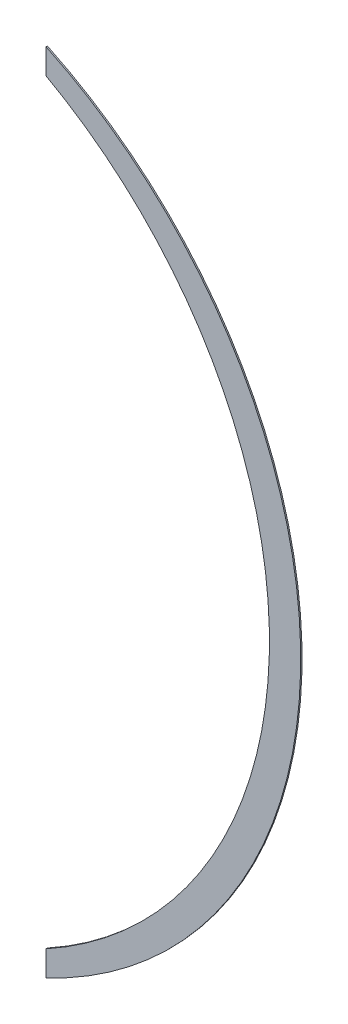
ISO-10303-21;
HEADER;
FILE_DESCRIPTION(('STEP AP214'),'2;1');
FILE_NAME('part.step','',(''),(''),'','','');
FILE_SCHEMA(('AUTOMOTIVE_DESIGN { 1 0 10303 214 1 1 1 1 }'));
ENDSEC;
DATA;
#1=APPLICATION_CONTEXT('core data for automotive mechanical design processes');
#2=APPLICATION_PROTOCOL_DEFINITION('international standard','automotive_design',2000,#1);
#3=PRODUCT_CONTEXT('',#1,'mechanical');
#4=PRODUCT('Part','Part','',(#3));
#5=PRODUCT_RELATED_PRODUCT_CATEGORY('part','',(#4));
#6=PRODUCT_DEFINITION_FORMATION('','',#4);
#7=PRODUCT_DEFINITION_CONTEXT('part definition',#1,'design');
#8=PRODUCT_DEFINITION('design','',#6,#7);
#9=PRODUCT_DEFINITION_SHAPE('','',#8);
#10=(LENGTH_UNIT() NAMED_UNIT(*) SI_UNIT(.MILLI.,.METRE.));
#11=(NAMED_UNIT(*) PLANE_ANGLE_UNIT() SI_UNIT($,.RADIAN.));
#12=(NAMED_UNIT(*) SI_UNIT($,.STERADIAN.) SOLID_ANGLE_UNIT());
#13=UNCERTAINTY_MEASURE_WITH_UNIT(LENGTH_MEASURE(1.E-05),#10,'distance_accuracy_value','');
#14=(GEOMETRIC_REPRESENTATION_CONTEXT(3) GLOBAL_UNCERTAINTY_ASSIGNED_CONTEXT((#13)) GLOBAL_UNIT_ASSIGNED_CONTEXT((#10,
#11,#12)) REPRESENTATION_CONTEXT('',''));
#15=CARTESIAN_POINT('',(0.,0.,0.));
#16=DIRECTION('',(0.,0.,1.));
#17=DIRECTION('',(1.,0.,0.));
#18=AXIS2_PLACEMENT_3D('',#15,#16,#17);
#19=CARTESIAN_POINT('',(-409.519435663015,21.2338716897964,1.5));
#20=DIRECTION('',(0.,0.,-1.));
#21=DIRECTION('',(-1.,0.,0.));
#22=AXIS2_PLACEMENT_3D('',#19,#20,#21);
#23=CYLINDRICAL_SURFACE('',#22,500.);
#24=CARTESIAN_POINT('',(-409.519435663015,21.2338716897964,0.));
#25=DIRECTION('',(0.,0.,1.));
#26=DIRECTION('',(1.,0.,0.));
#27=AXIS2_PLACEMENT_3D('',#24,#25,#26);
#28=CIRCLE('',#27,500.);
#29=CARTESIAN_POINT('',(-194.557629782726,-430.198761172168,0.));
#30=VERTEX_POINT('',#29);
#31=CARTESIAN_POINT('',(-194.557629782726,472.666504551761,0.));
#32=VERTEX_POINT('',#31);
#33=EDGE_CURVE('E96',#30,#32,#28,.T.);
#34=ORIENTED_EDGE('',*,*,#33,.T.);
#35=DIRECTION('',(0.,0.,-1.));
#36=VECTOR('',#35,1.);
#37=CARTESIAN_POINT('',(-194.557629782726,472.666504551761,1.5));
#38=LINE('',#37,#36);
#39=CARTESIAN_POINT('',(-194.557629782726,472.666504551761,1.5));
#40=VERTEX_POINT('',#39);
#41=EDGE_CURVE('E11',#40,#32,#38,.T.);
#42=ORIENTED_EDGE('',*,*,#41,.F.);
#43=CARTESIAN_POINT('',(-409.519435663015,21.2338716897964,1.5));
#44=DIRECTION('',(0.,0.,1.));
#45=DIRECTION('',(1.,0.,0.));
#46=AXIS2_PLACEMENT_3D('',#43,#44,#45);
#47=CIRCLE('',#46,500.);
#48=CARTESIAN_POINT('',(-194.557629782726,-430.198761172168,1.5));
#49=VERTEX_POINT('',#48);
#50=EDGE_CURVE('E84',#49,#40,#47,.T.);
#51=ORIENTED_EDGE('',*,*,#50,.F.);
#52=DIRECTION('',(0.,0.,-1.));
#53=VECTOR('',#52,1.);
#54=CARTESIAN_POINT('',(-194.557629782726,-430.198761172168,1.5));
#55=LINE('',#54,#53);
#56=EDGE_CURVE('E92',#49,#30,#55,.T.);
#57=ORIENTED_EDGE('',*,*,#56,.T.);
#58=EDGE_LOOP('',(#34,#42,#51,#57));
#59=FACE_BOUND('',#58,.T.);
#60=ADVANCED_FACE('F33',(#59),#23,.T.);
#61=CARTESIAN_POINT('',(-194.557629782726,444.337194783204,1.5));
#62=DIRECTION('',(1.,0.,0.));
#63=DIRECTION('',(0.,0.,-1.));
#64=AXIS2_PLACEMENT_3D('',#61,#62,#63);
#65=PLANE('',#64);
#66=DIRECTION('',(0.,-1.,0.));
#67=VECTOR('',#66,1.);
#68=CARTESIAN_POINT('',(-194.557629782726,444.337194783204,0.));
#69=LINE('',#68,#67);
#70=CARTESIAN_POINT('',(-194.557629782726,444.337194783204,0.));
#71=VERTEX_POINT('',#70);
#72=EDGE_CURVE('E88',#32,#71,#69,.T.);
#73=ORIENTED_EDGE('',*,*,#72,.T.);
#74=DIRECTION('',(0.,0.,-1.));
#75=VECTOR('',#74,1.);
#76=CARTESIAN_POINT('',(-194.557629782726,444.337194783204,1.5));
#77=LINE('',#76,#75);
#78=CARTESIAN_POINT('',(-194.557629782726,444.337194783204,1.5));
#79=VERTEX_POINT('',#78);
#80=EDGE_CURVE('E41',#79,#71,#77,.T.);
#81=ORIENTED_EDGE('',*,*,#80,.F.);
#82=DIRECTION('',(0.,-1.,0.));
#83=VECTOR('',#82,1.);
#84=CARTESIAN_POINT('',(-194.557629782726,444.337194783204,1.5));
#85=LINE('',#84,#83);
#86=EDGE_CURVE('E79',#40,#79,#85,.T.);
#87=ORIENTED_EDGE('',*,*,#86,.F.);
#88=ORIENTED_EDGE('',*,*,#41,.T.);
#89=EDGE_LOOP('',(#73,#81,#87,#88));
#90=FACE_BOUND('',#89,.T.);
#91=ADVANCED_FACE('F87',(#90),#65,.F.);
#92=CARTESIAN_POINT('',(-427.522386746769,21.2338716897964,1.5));
#93=DIRECTION('',(0.,0.,-1.));
#94=DIRECTION('',(-1.,0.,0.));
#95=AXIS2_PLACEMENT_3D('',#92,#93,#94);
#96=CYLINDRICAL_SURFACE('',#95,483.);
#97=CARTESIAN_POINT('',(-427.522386746769,21.2338716897964,0.));
#98=DIRECTION('',(0.,0.,-1.));
#99=DIRECTION('',(1.,0.,0.));
#100=AXIS2_PLACEMENT_3D('',#97,#98,#99);
#101=CIRCLE('',#100,483.);
#102=CARTESIAN_POINT('',(-194.557629782727,-401.869451403612,0.));
#103=VERTEX_POINT('',#102);
#104=EDGE_CURVE('E66',#71,#103,#101,.T.);
#105=ORIENTED_EDGE('',*,*,#104,.T.);
#106=DIRECTION('',(0.,0.,-1.));
#107=VECTOR('',#106,1.);
#108=CARTESIAN_POINT('',(-194.557629782727,-401.869451403612,1.5));
#109=LINE('',#108,#107);
#110=CARTESIAN_POINT('',(-194.557629782727,-401.869451403612,1.5));
#111=VERTEX_POINT('',#110);
#112=EDGE_CURVE('E89',#111,#103,#109,.T.);
#113=ORIENTED_EDGE('',*,*,#112,.F.);
#114=CARTESIAN_POINT('',(-427.522386746769,21.2338716897964,1.5));
#115=DIRECTION('',(0.,0.,-1.));
#116=DIRECTION('',(1.,0.,0.));
#117=AXIS2_PLACEMENT_3D('',#114,#115,#116);
#118=CIRCLE('',#117,483.);
#119=EDGE_CURVE('E82',#79,#111,#118,.T.);
#120=ORIENTED_EDGE('',*,*,#119,.F.);
#121=ORIENTED_EDGE('',*,*,#80,.T.);
#122=EDGE_LOOP('',(#105,#113,#120,#121));
#123=FACE_BOUND('',#122,.T.);
#124=ADVANCED_FACE('F90',(#123),#96,.F.);
#125=CARTESIAN_POINT('',(-194.557629782726,-430.198761172168,1.5));
#126=DIRECTION('',(1.,0.,0.));
#127=DIRECTION('',(0.,0.,-1.));
#128=AXIS2_PLACEMENT_3D('',#125,#126,#127);
#129=PLANE('',#128);
#130=DIRECTION('',(0.,-1.,0.));
#131=VECTOR('',#130,1.);
#132=CARTESIAN_POINT('',(-194.557629782726,-430.198761172168,0.));
#133=LINE('',#132,#131);
#134=EDGE_CURVE('E72',#103,#30,#133,.T.);
#135=ORIENTED_EDGE('',*,*,#134,.T.);
#136=ORIENTED_EDGE('',*,*,#56,.F.);
#137=DIRECTION('',(0.,-1.,0.));
#138=VECTOR('',#137,1.);
#139=CARTESIAN_POINT('',(-194.557629782726,-430.198761172168,1.5));
#140=LINE('',#139,#138);
#141=EDGE_CURVE('E49',#111,#49,#140,.T.);
#142=ORIENTED_EDGE('',*,*,#141,.F.);
#143=ORIENTED_EDGE('',*,*,#112,.T.);
#144=EDGE_LOOP('',(#135,#136,#142,#143));
#145=FACE_BOUND('',#144,.T.);
#146=ADVANCED_FACE('F103',(#145),#129,.F.);
#147=CARTESIAN_POINT('',(-409.519435663015,21.2338716897964,1.5));
#148=DIRECTION('',(0.,0.,1.));
#149=DIRECTION('',(1.,0.,0.));
#150=AXIS2_PLACEMENT_3D('',#147,#148,#149);
#151=PLANE('',#150);
#152=ORIENTED_EDGE('',*,*,#50,.T.);
#153=ORIENTED_EDGE('',*,*,#86,.T.);
#154=ORIENTED_EDGE('',*,*,#119,.T.);
#155=ORIENTED_EDGE('',*,*,#141,.T.);
#156=EDGE_LOOP('',(#152,#153,#154,#155));
#157=FACE_BOUND('',#156,.T.);
#158=ADVANCED_FACE('F80',(#157),#151,.T.);
#159=CARTESIAN_POINT('',(-409.519435663015,21.2338716897964,0.));
#160=DIRECTION('',(0.,0.,1.));
#161=DIRECTION('',(1.,0.,0.));
#162=AXIS2_PLACEMENT_3D('',#159,#160,#161);
#163=PLANE('',#162);
#164=ORIENTED_EDGE('',*,*,#33,.F.);
#165=ORIENTED_EDGE('',*,*,#134,.F.);
#166=ORIENTED_EDGE('',*,*,#104,.F.);
#167=ORIENTED_EDGE('',*,*,#72,.F.);
#168=EDGE_LOOP('',(#164,#165,#166,#167));
#169=FACE_BOUND('',#168,.T.);
#170=ADVANCED_FACE('F106',(#169),#163,.F.);
#171=CLOSED_SHELL('',(#60,#91,#124,#146,#158,#170));
#172=MANIFOLD_SOLID_BREP('B2',#171);
#173=ADVANCED_BREP_SHAPE_REPRESENTATION('',(#18,#172),#14);
#174=SHAPE_DEFINITION_REPRESENTATION(#9,#173);
ENDSEC;
END-ISO-10303-21;
